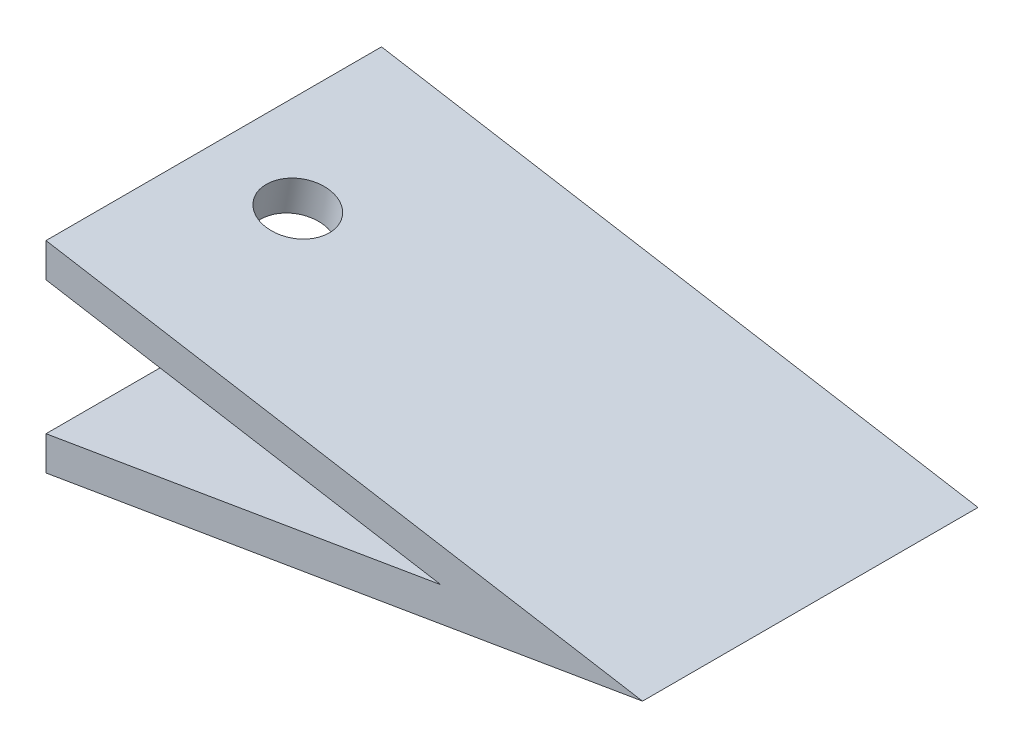
ISO-10303-21;
HEADER;
FILE_DESCRIPTION(('STEP AP214'),'2;1');
FILE_NAME('part.step','',(''),(''),'','','');
FILE_SCHEMA(('AUTOMOTIVE_DESIGN { 1 0 10303 214 1 1 1 1 }'));
ENDSEC;
DATA;
#1=APPLICATION_CONTEXT('core data for automotive mechanical design processes');
#2=APPLICATION_PROTOCOL_DEFINITION('international standard','automotive_design',2000,#1);
#3=PRODUCT_CONTEXT('',#1,'mechanical');
#4=PRODUCT('Part','Part','',(#3));
#5=PRODUCT_RELATED_PRODUCT_CATEGORY('part','',(#4));
#6=PRODUCT_DEFINITION_FORMATION('','',#4);
#7=PRODUCT_DEFINITION_CONTEXT('part definition',#1,'design');
#8=PRODUCT_DEFINITION('design','',#6,#7);
#9=PRODUCT_DEFINITION_SHAPE('','',#8);
#10=(LENGTH_UNIT() NAMED_UNIT(*) SI_UNIT(.MILLI.,.METRE.));
#11=(NAMED_UNIT(*) PLANE_ANGLE_UNIT() SI_UNIT($,.RADIAN.));
#12=(NAMED_UNIT(*) SI_UNIT($,.STERADIAN.) SOLID_ANGLE_UNIT());
#13=UNCERTAINTY_MEASURE_WITH_UNIT(LENGTH_MEASURE(1.E-05),#10,'distance_accuracy_value','');
#14=(GEOMETRIC_REPRESENTATION_CONTEXT(3) GLOBAL_UNCERTAINTY_ASSIGNED_CONTEXT((#13)) GLOBAL_UNIT_ASSIGNED_CONTEXT((#10,
#11,#12)) REPRESENTATION_CONTEXT('',''));
#15=CARTESIAN_POINT('',(0.,0.,0.));
#16=DIRECTION('',(0.,0.,1.));
#17=DIRECTION('',(1.,0.,0.));
#18=AXIS2_PLACEMENT_3D('',#15,#16,#17);
#19=CARTESIAN_POINT('',(0.,-73.1204734876538,5.));
#20=DIRECTION('',(1.,0.,0.));
#21=DIRECTION('',(0.,1.,0.));
#22=AXIS2_PLACEMENT_3D('',#19,#20,#21);
#23=PLANE('',#22);
#24=DIRECTION('',(0.,0.,-1.));
#25=VECTOR('',#24,1.);
#26=CARTESIAN_POINT('',(0.,-15.,5.));
#27=LINE('',#26,#25);
#28=CARTESIAN_POINT('',(0.,-15.,50.));
#29=VERTEX_POINT('',#28);
#30=CARTESIAN_POINT('',(0.,-15.,0.));
#31=VERTEX_POINT('',#30);
#32=EDGE_CURVE('E11',#29,#31,#27,.T.);
#33=ORIENTED_EDGE('',*,*,#32,.F.);
#34=DIRECTION('',(0.,1.,0.));
#35=VECTOR('',#34,1.);
#36=CARTESIAN_POINT('',(0.,-73.1204734876538,50.));
#37=LINE('',#36,#35);
#38=CARTESIAN_POINT('',(0.,-9.92932587150881,50.));
#39=VERTEX_POINT('',#38);
#40=EDGE_CURVE('E100',#29,#39,#37,.T.);
#41=ORIENTED_EDGE('',*,*,#40,.T.);
#42=DIRECTION('',(0.,0.,-1.));
#43=VECTOR('',#42,1.);
#44=CARTESIAN_POINT('',(0.,-9.92932587150881,50.));
#45=LINE('',#44,#43);
#46=CARTESIAN_POINT('',(0.,-9.92932587150881,5.));
#47=VERTEX_POINT('',#46);
#48=EDGE_CURVE('E91',#39,#47,#45,.T.);
#49=ORIENTED_EDGE('',*,*,#48,.T.);
#50=DIRECTION('',(0.,-1.,0.));
#51=VECTOR('',#50,1.);
#52=CARTESIAN_POINT('',(0.,-73.1204734876538,5.));
#53=LINE('',#52,#51);
#54=CARTESIAN_POINT('',(0.,9.92932587150884,5.));
#55=VERTEX_POINT('',#54);
#56=EDGE_CURVE('E51',#55,#47,#53,.T.);
#57=ORIENTED_EDGE('',*,*,#56,.F.);
#58=DIRECTION('',(0.,0.,-1.));
#59=VECTOR('',#58,1.);
#60=CARTESIAN_POINT('',(0.,9.92932587150884,50.));
#61=LINE('',#60,#59);
#62=CARTESIAN_POINT('',(0.,9.92932587150884,50.));
#63=VERTEX_POINT('',#62);
#64=EDGE_CURVE('E121',#63,#55,#61,.T.);
#65=ORIENTED_EDGE('',*,*,#64,.F.);
#66=DIRECTION('',(0.,-1.,0.));
#67=VECTOR('',#66,1.);
#68=CARTESIAN_POINT('',(0.,-73.1204734876538,50.));
#69=LINE('',#68,#67);
#70=CARTESIAN_POINT('',(0.,15.,50.));
#71=VERTEX_POINT('',#70);
#72=EDGE_CURVE('E105',#71,#63,#69,.T.);
#73=ORIENTED_EDGE('',*,*,#72,.F.);
#74=DIRECTION('',(0.,0.,-1.));
#75=VECTOR('',#74,1.);
#76=CARTESIAN_POINT('',(0.,15.,5.));
#77=LINE('',#76,#75);
#78=CARTESIAN_POINT('',(0.,15.,0.));
#79=VERTEX_POINT('',#78);
#80=EDGE_CURVE('E128',#71,#79,#77,.T.);
#81=ORIENTED_EDGE('',*,*,#80,.T.);
#82=DIRECTION('',(0.,-1.,0.));
#83=VECTOR('',#82,1.);
#84=CARTESIAN_POINT('',(0.,-73.1204734876538,0.));
#85=LINE('',#84,#83);
#86=EDGE_CURVE('E126',#79,#31,#85,.T.);
#87=ORIENTED_EDGE('',*,*,#86,.T.);
#88=EDGE_LOOP('',(#33,#41,#49,#57,#65,#73,#81,#87));
#89=FACE_BOUND('',#88,.T.);
#90=ADVANCED_FACE('F33',(#89),#23,.F.);
#91=CARTESIAN_POINT('',(33.6844192145889,-9.31646469945069,5.));
#92=DIRECTION('',(0.166377196217691,-0.986062182916848,0.));
#93=DIRECTION('',(0.986062182916848,0.166377196217691,0.));
#94=AXIS2_PLACEMENT_3D('',#91,#92,#93);
#95=PLANE('',#94);
#96=CARTESIAN_POINT('',(12.522989723044,-12.8870096080353,25.));
#97=DIRECTION('',(0.166377196217691,-0.986062182916848,0.));
#98=DIRECTION('',(0.986062182916848,0.166377196217691,0.));
#99=AXIS2_PLACEMENT_3D('',#96,#97,#98);
#100=CIRCLE('',#99,4.7625);
#101=CARTESIAN_POINT('',(17.2191108691855,-12.0946382110486,25.));
#102=VERTEX_POINT('',#101);
#103=EDGE_CURVE('E171',#102,#102,#100,.T.);
#104=ORIENTED_EDGE('',*,*,#103,.F.);
#105=EDGE_LOOP('',(#104));
#106=FACE_BOUND('',#105,.T.);
#107=DIRECTION('',(-0.986062182916848,-0.166377196217691,0.));
#108=VECTOR('',#107,1.);
#109=CARTESIAN_POINT('',(33.6844192145889,-9.31646469945069,0.));
#110=LINE('',#109,#108);
#111=CARTESIAN_POINT('',(88.9,0.,0.));
#112=VERTEX_POINT('',#111);
#113=EDGE_CURVE('E131',#112,#31,#110,.T.);
#114=ORIENTED_EDGE('',*,*,#113,.F.);
#115=DIRECTION('',(0.,0.,-1.));
#116=VECTOR('',#115,1.);
#117=CARTESIAN_POINT('',(88.9,0.,5.));
#118=LINE('',#117,#116);
#119=CARTESIAN_POINT('',(88.9,0.,50.));
#120=VERTEX_POINT('',#119);
#121=EDGE_CURVE('E40',#120,#112,#118,.T.);
#122=ORIENTED_EDGE('',*,*,#121,.F.);
#123=DIRECTION('',(-0.986062182916848,-0.166377196217691,0.));
#124=VECTOR('',#123,1.);
#125=CARTESIAN_POINT('',(33.6844192145889,-9.31646469945069,50.));
#126=LINE('',#125,#124);
#127=EDGE_CURVE('E115',#120,#29,#126,.T.);
#128=ORIENTED_EDGE('',*,*,#127,.T.);
#129=ORIENTED_EDGE('',*,*,#32,.T.);
#130=EDGE_LOOP('',(#114,#122,#128,#129));
#131=FACE_BOUND('',#130,.T.);
#132=ADVANCED_FACE('F146',(#106,#131),#95,.T.);
#133=CARTESIAN_POINT('',(57.6764547047611,5.26831472923042,5.));
#134=DIRECTION('',(-0.166377196217691,-0.986062182916848,0.));
#135=DIRECTION('',(0.986062182916848,-0.166377196217691,0.));
#136=AXIS2_PLACEMENT_3D('',#133,#134,#135);
#137=PLANE('',#136);
#138=CARTESIAN_POINT('',(12.522989723044,12.8870096080353,25.));
#139=DIRECTION('',(0.166377196217691,0.986062182916848,0.));
#140=DIRECTION('',(-0.986062182916848,0.166377196217691,0.));
#141=AXIS2_PLACEMENT_3D('',#138,#139,#140);
#142=CIRCLE('',#141,4.7625);
#143=CARTESIAN_POINT('',(7.82686857690249,13.6793810050221,25.));
#144=VERTEX_POINT('',#143);
#145=EDGE_CURVE('E174',#144,#144,#142,.T.);
#146=ORIENTED_EDGE('',*,*,#145,.F.);
#147=EDGE_LOOP('',(#146));
#148=FACE_BOUND('',#147,.T.);
#149=DIRECTION('',(-0.986062182916848,0.166377196217691,0.));
#150=VECTOR('',#149,1.);
#151=CARTESIAN_POINT('',(57.6764547047611,5.26831472923042,0.));
#152=LINE('',#151,#150);
#153=EDGE_CURVE('E129',#112,#79,#152,.T.);
#154=ORIENTED_EDGE('',*,*,#153,.T.);
#155=ORIENTED_EDGE('',*,*,#80,.F.);
#156=DIRECTION('',(-0.986062182916848,0.166377196217691,0.));
#157=VECTOR('',#156,1.);
#158=CARTESIAN_POINT('',(57.6764547047611,5.26831472923042,50.));
#159=LINE('',#158,#157);
#160=EDGE_CURVE('E118',#120,#71,#159,.T.);
#161=ORIENTED_EDGE('',*,*,#160,.F.);
#162=ORIENTED_EDGE('',*,*,#121,.T.);
#163=EDGE_LOOP('',(#154,#155,#161,#162));
#164=FACE_BOUND('',#163,.T.);
#165=ADVANCED_FACE('F139',(#148,#164),#137,.F.);
#166=CARTESIAN_POINT('',(44.45,-73.1204734876538,5.));
#167=DIRECTION('',(0.,0.,1.));
#168=DIRECTION('',(1.,0.,0.));
#169=AXIS2_PLACEMENT_3D('',#166,#167,#168);
#170=PLANE('',#169);
#171=CARTESIAN_POINT('',(12.7,0.,5.));
#172=DIRECTION('',(0.,0.,1.));
#173=DIRECTION('',(1.,0.,0.));
#174=AXIS2_PLACEMENT_3D('',#171,#172,#173);
#175=CIRCLE('',#174,4.7625);
#176=CARTESIAN_POINT('',(17.4625,0.,5.));
#177=VERTEX_POINT('',#176);
#178=EDGE_CURVE('E110',#177,#177,#175,.T.);
#179=ORIENTED_EDGE('',*,*,#178,.F.);
#180=EDGE_LOOP('',(#179));
#181=FACE_BOUND('',#180,.T.);
#182=DIRECTION('',(0.986062182916848,-0.166377196217691,0.));
#183=VECTOR('',#182,1.);
#184=CARTESIAN_POINT('',(56.8445687236727,0.338003814646187,5.));
#185=LINE('',#184,#183);
#186=CARTESIAN_POINT('',(58.8478046651423,0.,5.));
#187=VERTEX_POINT('',#186);
#188=EDGE_CURVE('E89',#55,#187,#185,.T.);
#189=ORIENTED_EDGE('',*,*,#188,.F.);
#190=ORIENTED_EDGE('',*,*,#56,.T.);
#191=DIRECTION('',(0.986062182916848,0.166377196217691,0.));
#192=VECTOR('',#191,1.);
#193=CARTESIAN_POINT('',(32.8525332335005,-4.38615378486644,5.));
#194=LINE('',#193,#192);
#195=EDGE_CURVE('E47',#47,#187,#194,.T.);
#196=ORIENTED_EDGE('',*,*,#195,.T.);
#197=EDGE_LOOP('',(#189,#190,#196));
#198=FACE_BOUND('',#197,.T.);
#199=ADVANCED_FACE('F148',(#181,#198),#170,.T.);
#200=CARTESIAN_POINT('',(44.45,-73.1204734876538,0.));
#201=DIRECTION('',(0.,0.,1.));
#202=DIRECTION('',(1.,0.,0.));
#203=AXIS2_PLACEMENT_3D('',#200,#201,#202);
#204=PLANE('',#203);
#205=CARTESIAN_POINT('',(12.7,0.,0.));
#206=DIRECTION('',(0.,0.,1.));
#207=DIRECTION('',(1.,0.,0.));
#208=AXIS2_PLACEMENT_3D('',#205,#206,#207);
#209=CIRCLE('',#208,4.7625);
#210=CARTESIAN_POINT('',(17.4625,0.,0.));
#211=VERTEX_POINT('',#210);
#212=EDGE_CURVE('E107',#211,#211,#209,.T.);
#213=ORIENTED_EDGE('',*,*,#212,.T.);
#214=EDGE_LOOP('',(#213));
#215=FACE_BOUND('',#214,.T.);
#216=ORIENTED_EDGE('',*,*,#113,.T.);
#217=ORIENTED_EDGE('',*,*,#86,.F.);
#218=ORIENTED_EDGE('',*,*,#153,.F.);
#219=EDGE_LOOP('',(#216,#217,#218));
#220=FACE_BOUND('',#219,.T.);
#221=ADVANCED_FACE('F145',(#215,#220),#204,.F.);
#222=CARTESIAN_POINT('',(56.8445687236727,0.338003814646187,50.));
#223=DIRECTION('',(-0.166377196217691,-0.986062182916848,0.));
#224=DIRECTION('',(0.986062182916848,-0.166377196217691,0.));
#225=AXIS2_PLACEMENT_3D('',#222,#223,#224);
#226=PLANE('',#225);
#227=CARTESIAN_POINT('',(11.6911037419555,7.9566986934511,25.));
#228=DIRECTION('',(-0.166377196217691,-0.986062182916848,0.));
#229=DIRECTION('',(0.986062182916848,-0.166377196217691,0.));
#230=AXIS2_PLACEMENT_3D('',#227,#228,#229);
#231=CIRCLE('',#230,4.7625);
#232=CARTESIAN_POINT('',(16.387224888097,7.16432729646435,25.));
#233=VERTEX_POINT('',#232);
#234=EDGE_CURVE('E179',#233,#233,#231,.F.);
#235=ORIENTED_EDGE('',*,*,#234,.T.);
#236=EDGE_LOOP('',(#235));
#237=FACE_BOUND('',#236,.T.);
#238=ORIENTED_EDGE('',*,*,#64,.T.);
#239=ORIENTED_EDGE('',*,*,#188,.T.);
#240=DIRECTION('',(0.,0.,-1.));
#241=VECTOR('',#240,1.);
#242=CARTESIAN_POINT('',(58.8478046651423,0.,50.));
#243=LINE('',#242,#241);
#244=CARTESIAN_POINT('',(58.8478046651423,0.,50.));
#245=VERTEX_POINT('',#244);
#246=EDGE_CURVE('E83',#245,#187,#243,.T.);
#247=ORIENTED_EDGE('',*,*,#246,.F.);
#248=DIRECTION('',(-0.986062182916848,0.166377196217691,0.));
#249=VECTOR('',#248,1.);
#250=CARTESIAN_POINT('',(56.8445687236727,0.338003814646187,50.));
#251=LINE('',#250,#249);
#252=EDGE_CURVE('E88',#245,#63,#251,.T.);
#253=ORIENTED_EDGE('',*,*,#252,.T.);
#254=EDGE_LOOP('',(#238,#239,#247,#253));
#255=FACE_BOUND('',#254,.T.);
#256=ADVANCED_FACE('F86',(#237,#255),#226,.T.);
#257=CARTESIAN_POINT('',(32.8525332335005,-4.38615378486644,50.));
#258=DIRECTION('',(0.166377196217691,-0.986062182916848,0.));
#259=DIRECTION('',(0.986062182916848,0.166377196217691,0.));
#260=AXIS2_PLACEMENT_3D('',#257,#258,#259);
#261=PLANE('',#260);
#262=CARTESIAN_POINT('',(11.6911037419555,-7.95669869345108,25.));
#263=DIRECTION('',(0.166377196217691,-0.986062182916848,0.));
#264=DIRECTION('',(0.986062182916848,0.166377196217691,0.));
#265=AXIS2_PLACEMENT_3D('',#262,#263,#264);
#266=CIRCLE('',#265,4.7625);
#267=CARTESIAN_POINT('',(16.387224888097,-7.16432729646432,25.));
#268=VERTEX_POINT('',#267);
#269=EDGE_CURVE('E173',#268,#268,#266,.F.);
#270=ORIENTED_EDGE('',*,*,#269,.F.);
#271=EDGE_LOOP('',(#270));
#272=FACE_BOUND('',#271,.T.);
#273=ORIENTED_EDGE('',*,*,#195,.F.);
#274=ORIENTED_EDGE('',*,*,#48,.F.);
#275=DIRECTION('',(-0.986062182916848,-0.166377196217691,0.));
#276=VECTOR('',#275,1.);
#277=CARTESIAN_POINT('',(32.8525332335005,-4.38615378486644,50.));
#278=LINE('',#277,#276);
#279=EDGE_CURVE('E94',#245,#39,#278,.T.);
#280=ORIENTED_EDGE('',*,*,#279,.F.);
#281=ORIENTED_EDGE('',*,*,#246,.T.);
#282=EDGE_LOOP('',(#273,#274,#280,#281));
#283=FACE_BOUND('',#282,.T.);
#284=ADVANCED_FACE('F95',(#272,#283),#261,.F.);
#285=CARTESIAN_POINT('',(44.45,-73.1204734876538,50.));
#286=DIRECTION('',(0.,0.,1.));
#287=DIRECTION('',(1.,0.,0.));
#288=AXIS2_PLACEMENT_3D('',#285,#286,#287);
#289=PLANE('',#288);
#290=ORIENTED_EDGE('',*,*,#252,.F.);
#291=ORIENTED_EDGE('',*,*,#279,.T.);
#292=ORIENTED_EDGE('',*,*,#40,.F.);
#293=ORIENTED_EDGE('',*,*,#127,.F.);
#294=ORIENTED_EDGE('',*,*,#160,.T.);
#295=ORIENTED_EDGE('',*,*,#72,.T.);
#296=EDGE_LOOP('',(#290,#291,#292,#293,#294,#295));
#297=FACE_BOUND('',#296,.T.);
#298=ADVANCED_FACE('F102',(#297),#289,.T.);
#299=CARTESIAN_POINT('',(12.7,0.,0.));
#300=DIRECTION('',(0.,0.,1.));
#301=DIRECTION('',(1.,0.,0.));
#302=AXIS2_PLACEMENT_3D('',#299,#300,#301);
#303=CYLINDRICAL_SURFACE('',#302,4.7625);
#304=ORIENTED_EDGE('',*,*,#212,.F.);
#305=EDGE_LOOP('',(#304));
#306=FACE_BOUND('',#305,.T.);
#307=ORIENTED_EDGE('',*,*,#178,.T.);
#308=EDGE_LOOP('',(#307));
#309=FACE_BOUND('',#308,.T.);
#310=ADVANCED_FACE('F195',(#306,#309),#303,.F.);
#311=CARTESIAN_POINT('',(7.60105014471123,16.2836856262168,25.));
#312=DIRECTION('',(0.166377196217691,-0.986062182916848,0.));
#313=DIRECTION('',(0.986062182916848,0.166377196217691,0.));
#314=AXIS2_PLACEMENT_3D('',#311,#312,#313);
#315=CYLINDRICAL_SURFACE('',#314,4.7625);
#316=ORIENTED_EDGE('',*,*,#103,.T.);
#317=EDGE_LOOP('',(#316));
#318=FACE_BOUND('',#317,.T.);
#319=ORIENTED_EDGE('',*,*,#269,.T.);
#320=EDGE_LOOP('',(#319));
#321=FACE_BOUND('',#320,.T.);
#322=ADVANCED_FACE('F189',(#318,#321),#315,.F.);
#323=CARTESIAN_POINT('',(7.60105014471123,-16.2836856262168,25.));
#324=DIRECTION('',(0.166377196217691,0.986062182916848,0.));
#325=DIRECTION('',(-0.986062182916848,0.166377196217691,0.));
#326=AXIS2_PLACEMENT_3D('',#323,#324,#325);
#327=CYLINDRICAL_SURFACE('',#326,4.7625);
#328=ORIENTED_EDGE('',*,*,#234,.F.);
#329=EDGE_LOOP('',(#328));
#330=FACE_BOUND('',#329,.T.);
#331=ORIENTED_EDGE('',*,*,#145,.T.);
#332=EDGE_LOOP('',(#331));
#333=FACE_BOUND('',#332,.T.);
#334=ADVANCED_FACE('F186',(#330,#333),#327,.F.);
#335=CLOSED_SHELL('',(#90,#132,#165,#199,#221,#256,#284,#298,#310,#322,#334));
#336=MANIFOLD_SOLID_BREP('B2',#335);
#337=ADVANCED_BREP_SHAPE_REPRESENTATION('',(#18,#336),#14);
#338=SHAPE_DEFINITION_REPRESENTATION(#9,#337);
ENDSEC;
END-ISO-10303-21;
